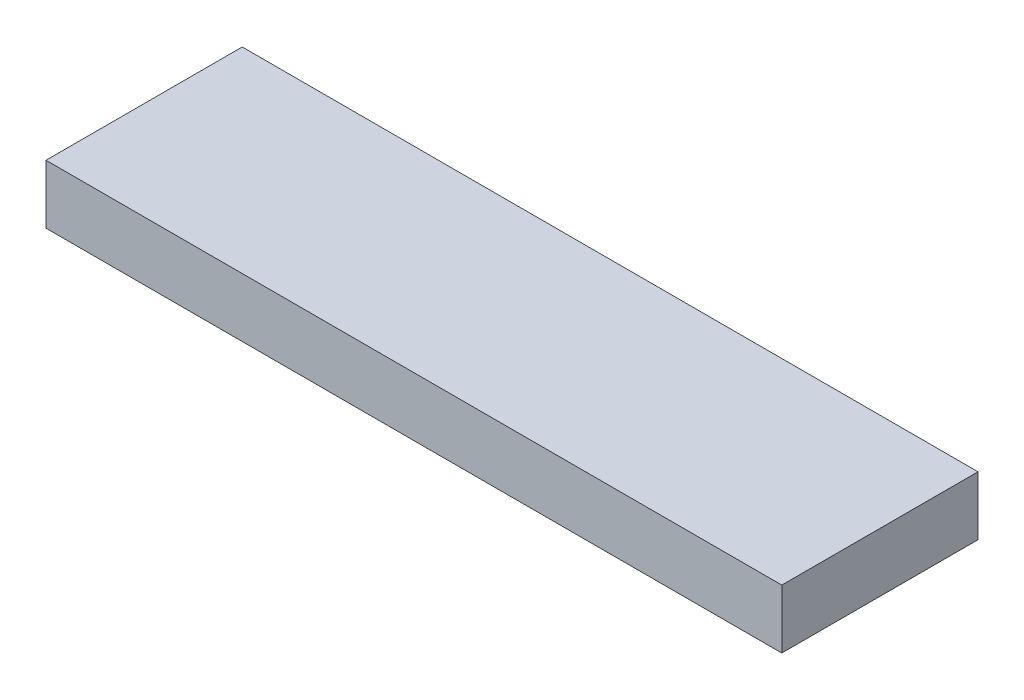
ISO-10303-21;
HEADER;
FILE_DESCRIPTION(('STEP AP214'),'2;1');
FILE_NAME('part.step','',(''),(''),'','','');
FILE_SCHEMA(('AUTOMOTIVE_DESIGN { 1 0 10303 214 1 1 1 1 }'));
ENDSEC;
DATA;
#1=APPLICATION_CONTEXT('core data for automotive mechanical design processes');
#2=APPLICATION_PROTOCOL_DEFINITION('international standard','automotive_design',2000,#1);
#3=PRODUCT_CONTEXT('',#1,'mechanical');
#4=PRODUCT('Part','Part','',(#3));
#5=PRODUCT_RELATED_PRODUCT_CATEGORY('part','',(#4));
#6=PRODUCT_DEFINITION_FORMATION('','',#4);
#7=PRODUCT_DEFINITION_CONTEXT('part definition',#1,'design');
#8=PRODUCT_DEFINITION('design','',#6,#7);
#9=PRODUCT_DEFINITION_SHAPE('','',#8);
#10=(LENGTH_UNIT() NAMED_UNIT(*) SI_UNIT(.MILLI.,.METRE.));
#11=(NAMED_UNIT(*) PLANE_ANGLE_UNIT() SI_UNIT($,.RADIAN.));
#12=(NAMED_UNIT(*) SI_UNIT($,.STERADIAN.) SOLID_ANGLE_UNIT());
#13=UNCERTAINTY_MEASURE_WITH_UNIT(LENGTH_MEASURE(1.E-05),#10,'distance_accuracy_value','');
#14=(GEOMETRIC_REPRESENTATION_CONTEXT(3) GLOBAL_UNCERTAINTY_ASSIGNED_CONTEXT((#13)) GLOBAL_UNIT_ASSIGNED_CONTEXT((#10,
#11,#12)) REPRESENTATION_CONTEXT('',''));
#15=CARTESIAN_POINT('',(0.,0.,0.));
#16=DIRECTION('',(0.,0.,1.));
#17=DIRECTION('',(1.,0.,0.));
#18=AXIS2_PLACEMENT_3D('',#15,#16,#17);
#19=CARTESIAN_POINT('',(75.,12.,20.));
#20=DIRECTION('',(-1.,0.,0.));
#21=DIRECTION('',(0.,0.,1.));
#22=AXIS2_PLACEMENT_3D('',#19,#20,#21);
#23=PLANE('',#22);
#24=DIRECTION('',(0.,0.,-1.));
#25=VECTOR('',#24,1.);
#26=CARTESIAN_POINT('',(75.,0.,20.));
#27=LINE('',#26,#25);
#28=CARTESIAN_POINT('',(75.,0.,20.));
#29=VERTEX_POINT('',#28);
#30=CARTESIAN_POINT('',(75.,0.,-20.));
#31=VERTEX_POINT('',#30);
#32=EDGE_CURVE('E96',#29,#31,#27,.T.);
#33=ORIENTED_EDGE('',*,*,#32,.T.);
#34=DIRECTION('',(0.,-1.,0.));
#35=VECTOR('',#34,1.);
#36=CARTESIAN_POINT('',(75.,12.,-20.));
#37=LINE('',#36,#35);
#38=CARTESIAN_POINT('',(75.,12.,-20.));
#39=VERTEX_POINT('',#38);
#40=EDGE_CURVE('E11',#39,#31,#37,.T.);
#41=ORIENTED_EDGE('',*,*,#40,.F.);
#42=DIRECTION('',(0.,0.,-1.));
#43=VECTOR('',#42,1.);
#44=CARTESIAN_POINT('',(75.,12.,20.));
#45=LINE('',#44,#43);
#46=CARTESIAN_POINT('',(75.,12.,20.));
#47=VERTEX_POINT('',#46);
#48=EDGE_CURVE('E84',#47,#39,#45,.T.);
#49=ORIENTED_EDGE('',*,*,#48,.F.);
#50=DIRECTION('',(0.,-1.,0.));
#51=VECTOR('',#50,1.);
#52=CARTESIAN_POINT('',(75.,12.,20.));
#53=LINE('',#52,#51);
#54=EDGE_CURVE('E92',#47,#29,#53,.T.);
#55=ORIENTED_EDGE('',*,*,#54,.T.);
#56=EDGE_LOOP('',(#33,#41,#49,#55));
#57=FACE_BOUND('',#56,.T.);
#58=ADVANCED_FACE('F33',(#57),#23,.F.);
#59=CARTESIAN_POINT('',(-75.,12.,-20.));
#60=DIRECTION('',(0.,0.,1.));
#61=DIRECTION('',(1.,0.,0.));
#62=AXIS2_PLACEMENT_3D('',#59,#60,#61);
#63=PLANE('',#62);
#64=DIRECTION('',(-1.,0.,0.));
#65=VECTOR('',#64,1.);
#66=CARTESIAN_POINT('',(-75.,0.,-20.));
#67=LINE('',#66,#65);
#68=CARTESIAN_POINT('',(-75.,0.,-20.));
#69=VERTEX_POINT('',#68);
#70=EDGE_CURVE('E88',#31,#69,#67,.T.);
#71=ORIENTED_EDGE('',*,*,#70,.T.);
#72=DIRECTION('',(0.,-1.,0.));
#73=VECTOR('',#72,1.);
#74=CARTESIAN_POINT('',(-75.,12.,-20.));
#75=LINE('',#74,#73);
#76=CARTESIAN_POINT('',(-75.,12.,-20.));
#77=VERTEX_POINT('',#76);
#78=EDGE_CURVE('E41',#77,#69,#75,.T.);
#79=ORIENTED_EDGE('',*,*,#78,.F.);
#80=DIRECTION('',(-1.,0.,0.));
#81=VECTOR('',#80,1.);
#82=CARTESIAN_POINT('',(-75.,12.,-20.));
#83=LINE('',#82,#81);
#84=EDGE_CURVE('E79',#39,#77,#83,.T.);
#85=ORIENTED_EDGE('',*,*,#84,.F.);
#86=ORIENTED_EDGE('',*,*,#40,.T.);
#87=EDGE_LOOP('',(#71,#79,#85,#86));
#88=FACE_BOUND('',#87,.T.);
#89=ADVANCED_FACE('F87',(#88),#63,.F.);
#90=CARTESIAN_POINT('',(-75.,12.,20.));
#91=DIRECTION('',(1.,0.,0.));
#92=DIRECTION('',(0.,0.,-1.));
#93=AXIS2_PLACEMENT_3D('',#90,#91,#92);
#94=PLANE('',#93);
#95=DIRECTION('',(0.,0.,1.));
#96=VECTOR('',#95,1.);
#97=CARTESIAN_POINT('',(-75.,0.,20.));
#98=LINE('',#97,#96);
#99=CARTESIAN_POINT('',(-75.,0.,20.));
#100=VERTEX_POINT('',#99);
#101=EDGE_CURVE('E66',#69,#100,#98,.T.);
#102=ORIENTED_EDGE('',*,*,#101,.T.);
#103=DIRECTION('',(0.,-1.,0.));
#104=VECTOR('',#103,1.);
#105=CARTESIAN_POINT('',(-75.,12.,20.));
#106=LINE('',#105,#104);
#107=CARTESIAN_POINT('',(-75.,12.,20.));
#108=VERTEX_POINT('',#107);
#109=EDGE_CURVE('E89',#108,#100,#106,.T.);
#110=ORIENTED_EDGE('',*,*,#109,.F.);
#111=DIRECTION('',(0.,0.,1.));
#112=VECTOR('',#111,1.);
#113=CARTESIAN_POINT('',(-75.,12.,20.));
#114=LINE('',#113,#112);
#115=EDGE_CURVE('E82',#77,#108,#114,.T.);
#116=ORIENTED_EDGE('',*,*,#115,.F.);
#117=ORIENTED_EDGE('',*,*,#78,.T.);
#118=EDGE_LOOP('',(#102,#110,#116,#117));
#119=FACE_BOUND('',#118,.T.);
#120=ADVANCED_FACE('F90',(#119),#94,.F.);
#121=CARTESIAN_POINT('',(-75.,12.,20.));
#122=DIRECTION('',(0.,0.,-1.));
#123=DIRECTION('',(-1.,0.,0.));
#124=AXIS2_PLACEMENT_3D('',#121,#122,#123);
#125=PLANE('',#124);
#126=DIRECTION('',(1.,0.,0.));
#127=VECTOR('',#126,1.);
#128=CARTESIAN_POINT('',(-75.,0.,20.));
#129=LINE('',#128,#127);
#130=EDGE_CURVE('E72',#100,#29,#129,.T.);
#131=ORIENTED_EDGE('',*,*,#130,.T.);
#132=ORIENTED_EDGE('',*,*,#54,.F.);
#133=DIRECTION('',(1.,0.,0.));
#134=VECTOR('',#133,1.);
#135=CARTESIAN_POINT('',(-75.,12.,20.));
#136=LINE('',#135,#134);
#137=EDGE_CURVE('E49',#108,#47,#136,.T.);
#138=ORIENTED_EDGE('',*,*,#137,.F.);
#139=ORIENTED_EDGE('',*,*,#109,.T.);
#140=EDGE_LOOP('',(#131,#132,#138,#139));
#141=FACE_BOUND('',#140,.T.);
#142=ADVANCED_FACE('F103',(#141),#125,.F.);
#143=CARTESIAN_POINT('',(0.,12.,0.));
#144=DIRECTION('',(0.,-1.,0.));
#145=DIRECTION('',(0.,0.,-1.));
#146=AXIS2_PLACEMENT_3D('',#143,#144,#145);
#147=PLANE('',#146);
#148=ORIENTED_EDGE('',*,*,#48,.T.);
#149=ORIENTED_EDGE('',*,*,#84,.T.);
#150=ORIENTED_EDGE('',*,*,#115,.T.);
#151=ORIENTED_EDGE('',*,*,#137,.T.);
#152=EDGE_LOOP('',(#148,#149,#150,#151));
#153=FACE_BOUND('',#152,.T.);
#154=ADVANCED_FACE('F80',(#153),#147,.F.);
#155=CARTESIAN_POINT('',(0.,0.,0.));
#156=DIRECTION('',(0.,-1.,0.));
#157=DIRECTION('',(0.,0.,-1.));
#158=AXIS2_PLACEMENT_3D('',#155,#156,#157);
#159=PLANE('',#158);
#160=ORIENTED_EDGE('',*,*,#32,.F.);
#161=ORIENTED_EDGE('',*,*,#130,.F.);
#162=ORIENTED_EDGE('',*,*,#101,.F.);
#163=ORIENTED_EDGE('',*,*,#70,.F.);
#164=EDGE_LOOP('',(#160,#161,#162,#163));
#165=FACE_BOUND('',#164,.T.);
#166=ADVANCED_FACE('F106',(#165),#159,.T.);
#167=CLOSED_SHELL('',(#58,#89,#120,#142,#154,#166));
#168=MANIFOLD_SOLID_BREP('B2',#167);
#169=ADVANCED_BREP_SHAPE_REPRESENTATION('',(#18,#168),#14);
#170=SHAPE_DEFINITION_REPRESENTATION(#9,#169);
ENDSEC;
END-ISO-10303-21;
